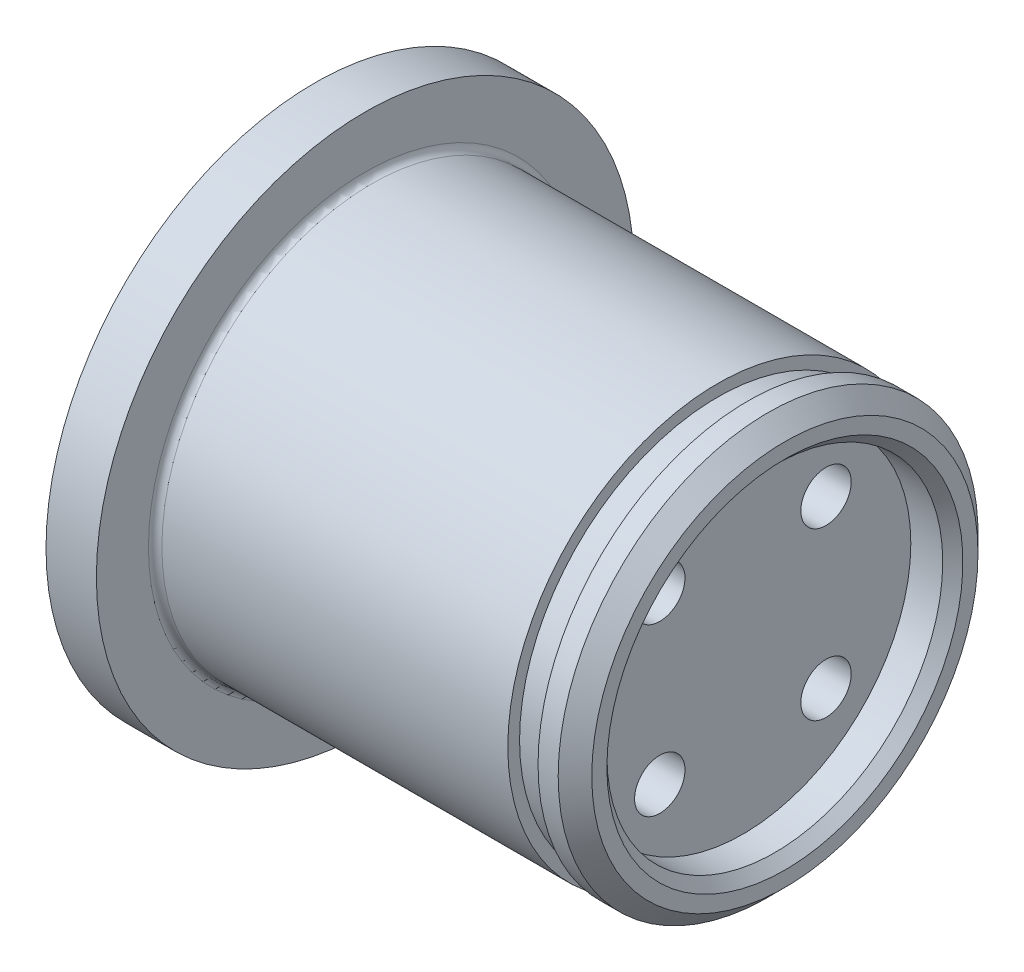
ISO-10303-21;
HEADER;
FILE_DESCRIPTION(('STEP AP214'),'2;1');
FILE_NAME('part.step','',(''),(''),'','','');
FILE_SCHEMA(('AUTOMOTIVE_DESIGN { 1 0 10303 214 1 1 1 1 }'));
ENDSEC;
DATA;
#1=APPLICATION_CONTEXT('core data for automotive mechanical design processes');
#2=APPLICATION_PROTOCOL_DEFINITION('international standard','automotive_design',2000,#1);
#3=PRODUCT_CONTEXT('',#1,'mechanical');
#4=PRODUCT('Part','Part','',(#3));
#5=PRODUCT_RELATED_PRODUCT_CATEGORY('part','',(#4));
#6=PRODUCT_DEFINITION_FORMATION('','',#4);
#7=PRODUCT_DEFINITION_CONTEXT('part definition',#1,'design');
#8=PRODUCT_DEFINITION('design','',#6,#7);
#9=PRODUCT_DEFINITION_SHAPE('','',#8);
#10=(LENGTH_UNIT() NAMED_UNIT(*) SI_UNIT(.MILLI.,.METRE.));
#11=(NAMED_UNIT(*) PLANE_ANGLE_UNIT() SI_UNIT($,.RADIAN.));
#12=(NAMED_UNIT(*) SI_UNIT($,.STERADIAN.) SOLID_ANGLE_UNIT());
#13=UNCERTAINTY_MEASURE_WITH_UNIT(LENGTH_MEASURE(1.E-05),#10,'distance_accuracy_value','');
#14=(GEOMETRIC_REPRESENTATION_CONTEXT(3) GLOBAL_UNCERTAINTY_ASSIGNED_CONTEXT((#13)) GLOBAL_UNIT_ASSIGNED_CONTEXT((#10,
#11,#12)) REPRESENTATION_CONTEXT('',''));
#15=CARTESIAN_POINT('',(0.,0.,0.));
#16=DIRECTION('',(0.,0.,1.));
#17=DIRECTION('',(1.,0.,0.));
#18=AXIS2_PLACEMENT_3D('',#15,#16,#17);
#19=CARTESIAN_POINT('',(0.,0.,0.));
#20=DIRECTION('',(-1.,0.,0.));
#21=DIRECTION('',(0.,0.,1.));
#22=AXIS2_PLACEMENT_3D('',#19,#20,#21);
#23=CYLINDRICAL_SURFACE('',#22,12.5);
#24=CARTESIAN_POINT('',(-24.6,0.,0.));
#25=DIRECTION('',(-1.,0.,0.));
#26=DIRECTION('',(0.,0.,1.));
#27=AXIS2_PLACEMENT_3D('',#24,#25,#26);
#28=CIRCLE('',#27,12.5);
#29=CARTESIAN_POINT('',(-24.6,0.,12.5));
#30=VERTEX_POINT('',#29);
#31=EDGE_CURVE('E44',#30,#30,#28,.F.);
#32=ORIENTED_EDGE('',*,*,#31,.T.);
#33=EDGE_LOOP('',(#32));
#34=FACE_BOUND('',#33,.T.);
#35=CARTESIAN_POINT('',(-4.00000000000001,0.,0.));
#36=DIRECTION('',(1.,0.,0.));
#37=DIRECTION('',(0.,0.,-1.));
#38=AXIS2_PLACEMENT_3D('',#35,#36,#37);
#39=CIRCLE('',#38,12.5);
#40=CARTESIAN_POINT('',(-4.00000000000001,0.,-12.5));
#41=VERTEX_POINT('',#40);
#42=EDGE_CURVE('E70',#41,#41,#39,.T.);
#43=ORIENTED_EDGE('',*,*,#42,.F.);
#44=EDGE_LOOP('',(#43));
#45=FACE_BOUND('',#44,.T.);
#46=ADVANCED_FACE('F33',(#34,#45),#23,.T.);
#47=CARTESIAN_POINT('',(-25.,12.5,0.));
#48=DIRECTION('',(-1.,0.,0.));
#49=DIRECTION('',(0.,0.,1.));
#50=AXIS2_PLACEMENT_3D('',#47,#48,#49);
#51=PLANE('',#50);
#52=CARTESIAN_POINT('',(-25.,0.,0.));
#53=DIRECTION('',(-1.,0.,0.));
#54=DIRECTION('',(0.,0.,1.));
#55=AXIS2_PLACEMENT_3D('',#52,#53,#54);
#56=CIRCLE('',#55,12.9);
#57=CARTESIAN_POINT('',(-25.,0.,12.9));
#58=VERTEX_POINT('',#57);
#59=EDGE_CURVE('E48',#58,#58,#56,.T.);
#60=ORIENTED_EDGE('',*,*,#59,.T.);
#61=EDGE_LOOP('',(#60));
#62=FACE_BOUND('',#61,.T.);
#63=CARTESIAN_POINT('',(-25.,0.,0.));
#64=DIRECTION('',(-1.,0.,0.));
#65=DIRECTION('',(0.,0.,1.));
#66=AXIS2_PLACEMENT_3D('',#63,#64,#65);
#67=CIRCLE('',#66,16.);
#68=CARTESIAN_POINT('',(-25.,0.,16.));
#69=VERTEX_POINT('',#68);
#70=EDGE_CURVE('E64',#69,#69,#67,.T.);
#71=ORIENTED_EDGE('',*,*,#70,.F.);
#72=EDGE_LOOP('',(#71));
#73=FACE_BOUND('',#72,.T.);
#74=ADVANCED_FACE('F121',(#62,#73),#51,.F.);
#75=CARTESIAN_POINT('',(0.,0.,0.));
#76=DIRECTION('',(-1.,0.,0.));
#77=DIRECTION('',(0.,0.,1.));
#78=AXIS2_PLACEMENT_3D('',#75,#76,#77);
#79=CYLINDRICAL_SURFACE('',#78,16.);
#80=CARTESIAN_POINT('',(-28.,0.,0.));
#81=DIRECTION('',(-1.,0.,0.));
#82=DIRECTION('',(0.,0.,1.));
#83=AXIS2_PLACEMENT_3D('',#80,#81,#82);
#84=CIRCLE('',#83,16.);
#85=CARTESIAN_POINT('',(-28.,0.,16.));
#86=VERTEX_POINT('',#85);
#87=EDGE_CURVE('E67',#86,#86,#84,.T.);
#88=ORIENTED_EDGE('',*,*,#87,.F.);
#89=EDGE_LOOP('',(#88));
#90=FACE_BOUND('',#89,.T.);
#91=ORIENTED_EDGE('',*,*,#70,.T.);
#92=EDGE_LOOP('',(#91));
#93=FACE_BOUND('',#92,.T.);
#94=ADVANCED_FACE('F128',(#90,#93),#79,.T.);
#95=CARTESIAN_POINT('',(-28.,16.,0.));
#96=DIRECTION('',(1.,0.,0.));
#97=DIRECTION('',(0.,0.,-1.));
#98=AXIS2_PLACEMENT_3D('',#95,#96,#97);
#99=PLANE('',#98);
#100=CARTESIAN_POINT('',(-28.,4.94974746830588,4.94974746830578));
#101=DIRECTION('',(1.,0.,0.));
#102=DIRECTION('',(0.,0.,-1.));
#103=AXIS2_PLACEMENT_3D('',#100,#101,#102);
#104=CIRCLE('',#103,1.50000000000001);
#105=CARTESIAN_POINT('',(-28.,4.94974746830588,3.44974746830577));
#106=VERTEX_POINT('',#105);
#107=EDGE_CURVE('E91',#106,#106,#104,.T.);
#108=ORIENTED_EDGE('',*,*,#107,.T.);
#109=EDGE_LOOP('',(#108));
#110=FACE_BOUND('',#109,.T.);
#111=CARTESIAN_POINT('',(-28.,-4.94974746830583,4.94974746830583));
#112=DIRECTION('',(1.,0.,0.));
#113=DIRECTION('',(0.,0.,-1.));
#114=AXIS2_PLACEMENT_3D('',#111,#112,#113);
#115=CIRCLE('',#114,1.50000000000001);
#116=CARTESIAN_POINT('',(-28.,-4.94974746830583,3.44974746830582));
#117=VERTEX_POINT('',#116);
#118=EDGE_CURVE('E88',#117,#117,#115,.T.);
#119=ORIENTED_EDGE('',*,*,#118,.T.);
#120=EDGE_LOOP('',(#119));
#121=FACE_BOUND('',#120,.T.);
#122=CARTESIAN_POINT('',(-28.,-4.94974746830585,-4.94974746830581));
#123=DIRECTION('',(1.,0.,0.));
#124=DIRECTION('',(0.,0.,-1.));
#125=AXIS2_PLACEMENT_3D('',#122,#123,#124);
#126=CIRCLE('',#125,1.50000000000001);
#127=CARTESIAN_POINT('',(-28.,-4.94974746830585,-6.44974746830583));
#128=VERTEX_POINT('',#127);
#129=EDGE_CURVE('E85',#128,#128,#126,.T.);
#130=ORIENTED_EDGE('',*,*,#129,.T.);
#131=EDGE_LOOP('',(#130));
#132=FACE_BOUND('',#131,.T.);
#133=CARTESIAN_POINT('',(-28.,4.94974746830583,-4.94974746830583));
#134=DIRECTION('',(1.,0.,0.));
#135=DIRECTION('',(0.,0.,-1.));
#136=AXIS2_PLACEMENT_3D('',#133,#134,#135);
#137=CIRCLE('',#136,1.50000000000001);
#138=CARTESIAN_POINT('',(-28.,4.94974746830583,-6.44974746830584));
#139=VERTEX_POINT('',#138);
#140=EDGE_CURVE('E82',#139,#139,#137,.T.);
#141=ORIENTED_EDGE('',*,*,#140,.T.);
#142=EDGE_LOOP('',(#141));
#143=FACE_BOUND('',#142,.T.);
#144=ORIENTED_EDGE('',*,*,#87,.T.);
#145=EDGE_LOOP('',(#144));
#146=FACE_BOUND('',#145,.T.);
#147=ADVANCED_FACE('F164',(#110,#121,#132,#143,#146),#99,.F.);
#148=CARTESIAN_POINT('',(-4.,12.5,0.));
#149=DIRECTION('',(-1.,0.,0.));
#150=DIRECTION('',(0.,0.,1.));
#151=AXIS2_PLACEMENT_3D('',#148,#149,#150);
#152=PLANE('',#151);
#153=CARTESIAN_POINT('',(-4.,0.,0.));
#154=DIRECTION('',(1.,0.,0.));
#155=DIRECTION('',(0.,0.,-1.));
#156=AXIS2_PLACEMENT_3D('',#153,#154,#155);
#157=CIRCLE('',#156,11.8);
#158=CARTESIAN_POINT('',(-4.,0.,-11.8));
#159=VERTEX_POINT('',#158);
#160=EDGE_CURVE('E73',#159,#159,#157,.T.);
#161=ORIENTED_EDGE('',*,*,#160,.F.);
#162=EDGE_LOOP('',(#161));
#163=FACE_BOUND('',#162,.T.);
#164=ORIENTED_EDGE('',*,*,#42,.T.);
#165=EDGE_LOOP('',(#164));
#166=FACE_BOUND('',#165,.T.);
#167=ADVANCED_FACE('F158',(#163,#166),#152,.F.);
#168=CARTESIAN_POINT('',(0.,0.,0.));
#169=DIRECTION('',(1.,0.,0.));
#170=DIRECTION('',(0.,0.,-1.));
#171=AXIS2_PLACEMENT_3D('',#168,#169,#170);
#172=CYLINDRICAL_SURFACE('',#171,11.8);
#173=CARTESIAN_POINT('',(-2.2,0.,0.));
#174=DIRECTION('',(1.,0.,0.));
#175=DIRECTION('',(0.,0.,-1.));
#176=AXIS2_PLACEMENT_3D('',#173,#174,#175);
#177=CIRCLE('',#176,11.8);
#178=CARTESIAN_POINT('',(-2.2,0.,-11.8));
#179=VERTEX_POINT('',#178);
#180=EDGE_CURVE('E76',#179,#179,#177,.T.);
#181=ORIENTED_EDGE('',*,*,#180,.F.);
#182=EDGE_LOOP('',(#181));
#183=FACE_BOUND('',#182,.T.);
#184=ORIENTED_EDGE('',*,*,#160,.T.);
#185=EDGE_LOOP('',(#184));
#186=FACE_BOUND('',#185,.T.);
#187=ADVANCED_FACE('F152',(#183,#186),#172,.T.);
#188=CARTESIAN_POINT('',(-2.2,11.8,0.));
#189=DIRECTION('',(1.,0.,0.));
#190=DIRECTION('',(0.,0.,-1.));
#191=AXIS2_PLACEMENT_3D('',#188,#189,#190);
#192=PLANE('',#191);
#193=CARTESIAN_POINT('',(-2.20000000000001,0.,0.));
#194=DIRECTION('',(1.,0.,0.));
#195=DIRECTION('',(0.,0.,-1.));
#196=AXIS2_PLACEMENT_3D('',#193,#194,#195);
#197=CIRCLE('',#196,12.5);
#198=CARTESIAN_POINT('',(-2.20000000000001,0.,-12.5));
#199=VERTEX_POINT('',#198);
#200=EDGE_CURVE('E79',#199,#199,#197,.T.);
#201=ORIENTED_EDGE('',*,*,#200,.F.);
#202=EDGE_LOOP('',(#201));
#203=FACE_BOUND('',#202,.T.);
#204=ORIENTED_EDGE('',*,*,#180,.T.);
#205=EDGE_LOOP('',(#204));
#206=FACE_BOUND('',#205,.T.);
#207=ADVANCED_FACE('F145',(#203,#206),#192,.F.);
#208=CARTESIAN_POINT('',(0.,0.,0.));
#209=DIRECTION('',(-1.,0.,0.));
#210=DIRECTION('',(0.,0.,1.));
#211=AXIS2_PLACEMENT_3D('',#208,#209,#210);
#212=PLANE('',#211);
#213=CARTESIAN_POINT('',(0.,0.,0.));
#214=DIRECTION('',(-1.,0.,0.));
#215=DIRECTION('',(0.,0.,1.));
#216=AXIS2_PLACEMENT_3D('',#213,#214,#215);
#217=CIRCLE('',#216,10.6);
#218=CARTESIAN_POINT('',(0.,0.,10.6));
#219=VERTEX_POINT('',#218);
#220=EDGE_CURVE('E10',#219,#219,#217,.T.);
#221=ORIENTED_EDGE('',*,*,#220,.T.);
#222=EDGE_LOOP('',(#221));
#223=FACE_BOUND('',#222,.T.);
#224=CARTESIAN_POINT('',(0.,0.,0.));
#225=DIRECTION('',(-1.,0.,0.));
#226=DIRECTION('',(0.,0.,1.));
#227=AXIS2_PLACEMENT_3D('',#224,#225,#226);
#228=CIRCLE('',#227,11.5);
#229=CARTESIAN_POINT('',(0.,0.,11.5));
#230=VERTEX_POINT('',#229);
#231=EDGE_CURVE('E58',#230,#230,#228,.F.);
#232=ORIENTED_EDGE('',*,*,#231,.T.);
#233=EDGE_LOOP('',(#232));
#234=FACE_BOUND('',#233,.T.);
#235=ADVANCED_FACE('F135',(#223,#234),#212,.F.);
#236=CARTESIAN_POINT('',(-1.00000000000001,0.,0.));
#237=DIRECTION('',(-1.,0.,0.));
#238=DIRECTION('',(0.,0.,1.));
#239=AXIS2_PLACEMENT_3D('',#236,#237,#238);
#240=CIRCLE('',#239,12.5);
#241=CARTESIAN_POINT('',(-1.00000000000001,0.,12.5));
#242=VERTEX_POINT('',#241);
#243=EDGE_CURVE('E61',#242,#242,#240,.T.);
#244=ORIENTED_EDGE('',*,*,#243,.T.);
#245=EDGE_LOOP('',(#244));
#246=FACE_BOUND('',#245,.T.);
#247=ORIENTED_EDGE('',*,*,#200,.T.);
#248=EDGE_LOOP('',(#247));
#249=FACE_BOUND('',#248,.T.);
#250=ADVANCED_FACE('F124',(#246,#249),#23,.T.);
#251=CARTESIAN_POINT('',(-1.00000000000001,0.,0.));
#252=DIRECTION('',(-1.,0.,0.));
#253=DIRECTION('',(0.,0.,1.));
#254=AXIS2_PLACEMENT_3D('',#251,#252,#253);
#255=CONICAL_SURFACE('',#254,12.5,0.785398163397449);
#256=ORIENTED_EDGE('',*,*,#231,.F.);
#257=EDGE_LOOP('',(#256));
#258=FACE_BOUND('',#257,.T.);
#259=ORIENTED_EDGE('',*,*,#243,.F.);
#260=EDGE_LOOP('',(#259));
#261=FACE_BOUND('',#260,.T.);
#262=ADVANCED_FACE('F134',(#258,#261),#255,.T.);
#263=CARTESIAN_POINT('',(-24.6,0.,0.));
#264=DIRECTION('',(-1.,0.,0.));
#265=DIRECTION('',(0.,0.,1.));
#266=AXIS2_PLACEMENT_3D('',#263,#264,#265);
#267=TOROIDAL_SURFACE('',#266,12.9,0.4);
#268=ORIENTED_EDGE('',*,*,#31,.F.);
#269=EDGE_LOOP('',(#268));
#270=FACE_BOUND('',#269,.T.);
#271=ORIENTED_EDGE('',*,*,#59,.F.);
#272=EDGE_LOOP('',(#271));
#273=FACE_BOUND('',#272,.T.);
#274=ADVANCED_FACE('F141',(#270,#273),#267,.F.);
#275=CARTESIAN_POINT('',(0.,4.94974746830583,-4.94974746830583));
#276=DIRECTION('',(1.,0.,0.));
#277=DIRECTION('',(0.,0.,-1.));
#278=AXIS2_PLACEMENT_3D('',#275,#276,#277);
#279=CYLINDRICAL_SURFACE('',#278,1.50000000000001);
#280=CARTESIAN_POINT('',(-2.5,4.94974746830583,-4.94974746830583));
#281=DIRECTION('',(-1.,0.,0.));
#282=DIRECTION('',(0.,0.,1.));
#283=AXIS2_PLACEMENT_3D('',#280,#281,#282);
#284=CIRCLE('',#283,1.50000000000001);
#285=CARTESIAN_POINT('',(-2.5,4.94974746830583,-3.44974746830582));
#286=VERTEX_POINT('',#285);
#287=EDGE_CURVE('E94',#286,#286,#284,.F.);
#288=ORIENTED_EDGE('',*,*,#287,.T.);
#289=EDGE_LOOP('',(#288));
#290=FACE_BOUND('',#289,.T.);
#291=ORIENTED_EDGE('',*,*,#140,.F.);
#292=EDGE_LOOP('',(#291));
#293=FACE_BOUND('',#292,.T.);
#294=ADVANCED_FACE('F198',(#290,#293),#279,.F.);
#295=CARTESIAN_POINT('',(0.,-4.94974746830585,-4.94974746830581));
#296=DIRECTION('',(1.,0.,0.));
#297=DIRECTION('',(0.,0.,-1.));
#298=AXIS2_PLACEMENT_3D('',#295,#296,#297);
#299=CYLINDRICAL_SURFACE('',#298,1.50000000000001);
#300=CARTESIAN_POINT('',(-2.5,-4.94974746830585,-4.94974746830581));
#301=DIRECTION('',(-1.,0.,0.));
#302=DIRECTION('',(0.,0.,1.));
#303=AXIS2_PLACEMENT_3D('',#300,#301,#302);
#304=CIRCLE('',#303,1.50000000000001);
#305=CARTESIAN_POINT('',(-2.5,-4.94974746830585,-3.4497474683058));
#306=VERTEX_POINT('',#305);
#307=EDGE_CURVE('E97',#306,#306,#304,.F.);
#308=ORIENTED_EDGE('',*,*,#307,.T.);
#309=EDGE_LOOP('',(#308));
#310=FACE_BOUND('',#309,.T.);
#311=ORIENTED_EDGE('',*,*,#129,.F.);
#312=EDGE_LOOP('',(#311));
#313=FACE_BOUND('',#312,.T.);
#314=ADVANCED_FACE('F202',(#310,#313),#299,.F.);
#315=CARTESIAN_POINT('',(0.,-4.94974746830583,4.94974746830583));
#316=DIRECTION('',(1.,0.,0.));
#317=DIRECTION('',(0.,0.,-1.));
#318=AXIS2_PLACEMENT_3D('',#315,#316,#317);
#319=CYLINDRICAL_SURFACE('',#318,1.50000000000001);
#320=CARTESIAN_POINT('',(-2.5,-4.94974746830583,4.94974746830583));
#321=DIRECTION('',(-1.,0.,0.));
#322=DIRECTION('',(0.,0.,1.));
#323=AXIS2_PLACEMENT_3D('',#320,#321,#322);
#324=CIRCLE('',#323,1.50000000000001);
#325=CARTESIAN_POINT('',(-2.5,-4.94974746830583,6.44974746830584));
#326=VERTEX_POINT('',#325);
#327=EDGE_CURVE('E53',#326,#326,#324,.F.);
#328=ORIENTED_EDGE('',*,*,#327,.T.);
#329=EDGE_LOOP('',(#328));
#330=FACE_BOUND('',#329,.T.);
#331=ORIENTED_EDGE('',*,*,#118,.F.);
#332=EDGE_LOOP('',(#331));
#333=FACE_BOUND('',#332,.T.);
#334=ADVANCED_FACE('F210',(#330,#333),#319,.F.);
#335=CARTESIAN_POINT('',(0.,4.94974746830588,4.94974746830578));
#336=DIRECTION('',(1.,0.,0.));
#337=DIRECTION('',(0.,0.,-1.));
#338=AXIS2_PLACEMENT_3D('',#335,#336,#337);
#339=CYLINDRICAL_SURFACE('',#338,1.50000000000001);
#340=CARTESIAN_POINT('',(-2.5,4.94974746830588,4.94974746830578));
#341=DIRECTION('',(-1.,0.,0.));
#342=DIRECTION('',(0.,0.,1.));
#343=AXIS2_PLACEMENT_3D('',#340,#341,#342);
#344=CIRCLE('',#343,1.50000000000001);
#345=CARTESIAN_POINT('',(-2.5,4.94974746830588,6.44974746830579));
#346=VERTEX_POINT('',#345);
#347=EDGE_CURVE('E51',#346,#346,#344,.F.);
#348=ORIENTED_EDGE('',*,*,#347,.T.);
#349=EDGE_LOOP('',(#348));
#350=FACE_BOUND('',#349,.T.);
#351=ORIENTED_EDGE('',*,*,#107,.F.);
#352=EDGE_LOOP('',(#351));
#353=FACE_BOUND('',#352,.T.);
#354=ADVANCED_FACE('F116',(#350,#353),#339,.F.);
#355=CARTESIAN_POINT('',(-2.5,10.,0.));
#356=DIRECTION('',(-1.,0.,0.));
#357=DIRECTION('',(0.,0.,1.));
#358=AXIS2_PLACEMENT_3D('',#355,#356,#357);
#359=PLANE('',#358);
#360=ORIENTED_EDGE('',*,*,#307,.F.);
#361=EDGE_LOOP('',(#360));
#362=FACE_BOUND('',#361,.T.);
#363=ORIENTED_EDGE('',*,*,#347,.F.);
#364=EDGE_LOOP('',(#363));
#365=FACE_BOUND('',#364,.T.);
#366=CARTESIAN_POINT('',(-2.5,0.,0.));
#367=DIRECTION('',(1.,0.,0.));
#368=DIRECTION('',(0.,0.,-1.));
#369=AXIS2_PLACEMENT_3D('',#366,#367,#368);
#370=CIRCLE('',#369,10.);
#371=CARTESIAN_POINT('',(-2.5,0.,-10.));
#372=VERTEX_POINT('',#371);
#373=EDGE_CURVE('E54',#372,#372,#370,.T.);
#374=ORIENTED_EDGE('',*,*,#373,.T.);
#375=EDGE_LOOP('',(#374));
#376=FACE_BOUND('',#375,.T.);
#377=ORIENTED_EDGE('',*,*,#327,.F.);
#378=EDGE_LOOP('',(#377));
#379=FACE_BOUND('',#378,.T.);
#380=ORIENTED_EDGE('',*,*,#287,.F.);
#381=EDGE_LOOP('',(#380));
#382=FACE_BOUND('',#381,.T.);
#383=ADVANCED_FACE('F105',(#362,#365,#376,#379,#382),#359,.F.);
#384=CARTESIAN_POINT('',(0.,0.,0.));
#385=DIRECTION('',(1.,0.,0.));
#386=DIRECTION('',(0.,0.,-1.));
#387=AXIS2_PLACEMENT_3D('',#384,#385,#386);
#388=CYLINDRICAL_SURFACE('',#387,10.);
#389=CARTESIAN_POINT('',(-0.600000000000005,0.,0.));
#390=DIRECTION('',(-1.,0.,0.));
#391=DIRECTION('',(0.,0.,1.));
#392=AXIS2_PLACEMENT_3D('',#389,#390,#391);
#393=CIRCLE('',#392,10.);
#394=CARTESIAN_POINT('',(-0.600000000000005,0.,10.));
#395=VERTEX_POINT('',#394);
#396=EDGE_CURVE('E40',#395,#395,#393,.F.);
#397=ORIENTED_EDGE('',*,*,#396,.T.);
#398=EDGE_LOOP('',(#397));
#399=FACE_BOUND('',#398,.T.);
#400=ORIENTED_EDGE('',*,*,#373,.F.);
#401=EDGE_LOOP('',(#400));
#402=FACE_BOUND('',#401,.T.);
#403=ADVANCED_FACE('F108',(#399,#402),#388,.F.);
#404=CARTESIAN_POINT('',(-0.600000000000005,0.,0.));
#405=DIRECTION('',(1.,0.,0.));
#406=DIRECTION('',(0.,0.,-1.));
#407=AXIS2_PLACEMENT_3D('',#404,#405,#406);
#408=CONICAL_SURFACE('',#407,10.,0.785398163397448);
#409=ORIENTED_EDGE('',*,*,#220,.F.);
#410=EDGE_LOOP('',(#409));
#411=FACE_BOUND('',#410,.T.);
#412=ORIENTED_EDGE('',*,*,#396,.F.);
#413=EDGE_LOOP('',(#412));
#414=FACE_BOUND('',#413,.T.);
#415=ADVANCED_FACE('F35',(#411,#414),#408,.F.);
#416=CLOSED_SHELL('',(#46,#74,#94,#147,#167,#187,#207,#235,#250,#262,#274,#294,#314,#334,#354,
#383,#403,#415));
#417=MANIFOLD_SOLID_BREP('B2',#416);
#418=ADVANCED_BREP_SHAPE_REPRESENTATION('',(#18,#417),#14);
#419=SHAPE_DEFINITION_REPRESENTATION(#9,#418);
ENDSEC;
END-ISO-10303-21;
